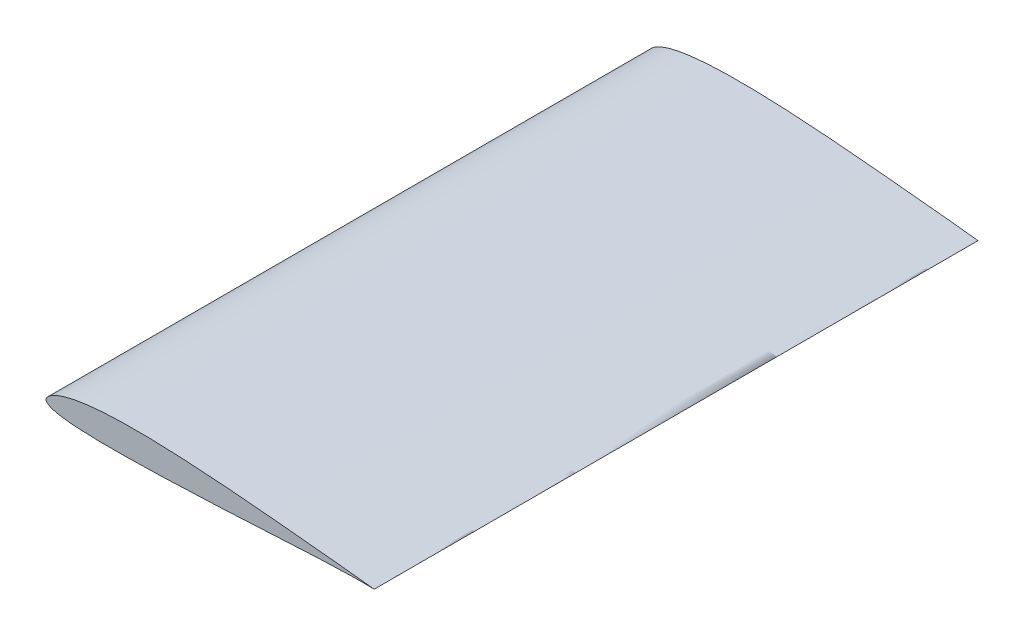
ISO-10303-21;
HEADER;
FILE_DESCRIPTION(('STEP AP214'),'2;1');
FILE_NAME('part.step','',(''),(''),'','','');
FILE_SCHEMA(('AUTOMOTIVE_DESIGN { 1 0 10303 214 1 1 1 1 }'));
ENDSEC;
DATA;
#1=APPLICATION_CONTEXT('core data for automotive mechanical design processes');
#2=APPLICATION_PROTOCOL_DEFINITION('international standard','automotive_design',2000,#1);
#3=PRODUCT_CONTEXT('',#1,'mechanical');
#4=PRODUCT('Part','Part','',(#3));
#5=PRODUCT_RELATED_PRODUCT_CATEGORY('part','',(#4));
#6=PRODUCT_DEFINITION_FORMATION('','',#4);
#7=PRODUCT_DEFINITION_CONTEXT('part definition',#1,'design');
#8=PRODUCT_DEFINITION('design','',#6,#7);
#9=PRODUCT_DEFINITION_SHAPE('','',#8);
#10=(LENGTH_UNIT() NAMED_UNIT(*) SI_UNIT(.MILLI.,.METRE.));
#11=(NAMED_UNIT(*) PLANE_ANGLE_UNIT() SI_UNIT($,.RADIAN.));
#12=(NAMED_UNIT(*) SI_UNIT($,.STERADIAN.) SOLID_ANGLE_UNIT());
#13=UNCERTAINTY_MEASURE_WITH_UNIT(LENGTH_MEASURE(1.E-05),#10,'distance_accuracy_value','');
#14=(GEOMETRIC_REPRESENTATION_CONTEXT(3) GLOBAL_UNCERTAINTY_ASSIGNED_CONTEXT((#13)) GLOBAL_UNIT_ASSIGNED_CONTEXT((#10,
#11,#12)) REPRESENTATION_CONTEXT('',''));
#15=CARTESIAN_POINT('',(0.,0.,0.));
#16=DIRECTION('',(0.,0.,1.));
#17=DIRECTION('',(1.,0.,0.));
#18=AXIS2_PLACEMENT_3D('',#15,#16,#17);
#19=CARTESIAN_POINT('',(125.,0.,230.));
#20=CARTESIAN_POINT('',(125.000051843613,0.00406372553250439,230.));
#21=CARTESIAN_POINT('',(124.156806782813,0.0755180317852404,230.));
#22=CARTESIAN_POINT('',(123.306301537015,0.182926610468012,230.));
#23=CARTESIAN_POINT('',(121.271537217048,0.419893677264012,230.));
#24=CARTESIAN_POINT('',(118.798426643432,0.712961509812303,230.));
#25=CARTESIAN_POINT('',(115.590288607837,1.05754578227251,230.));
#26=CARTESIAN_POINT('',(111.815042282613,1.44829560747886,230.));
#27=CARTESIAN_POINT('',(107.472282638317,1.89191265732372,230.));
#28=CARTESIAN_POINT('',(102.633370820047,2.37822068635726,230.));
#29=CARTESIAN_POINT('',(97.3569310280859,2.90426883520567,230.));
#30=CARTESIAN_POINT('',(91.7104855623496,3.45304997950713,230.));
#31=CARTESIAN_POINT('',(85.7656977338865,4.02103071092295,230.));
#32=CARTESIAN_POINT('',(79.5957960257255,4.58706398343916,230.));
#33=CARTESIAN_POINT('',(73.2733670987292,5.13521266551903,230.));
#34=CARTESIAN_POINT('',(66.8704254837791,5.64764322107569,230.));
#35=CARTESIAN_POINT('',(60.4567303279209,6.10516274386312,230.));
#36=CARTESIAN_POINT('',(54.1027810213215,6.49986280641166,230.));
#37=CARTESIAN_POINT('',(47.8750193390963,6.80798459402946,230.));
#38=CARTESIAN_POINT('',(41.8370577152785,7.02122305475196,230.));
#39=CARTESIAN_POINT('',(36.0473538336559,7.1228569033168,230.));
#40=CARTESIAN_POINT('',(30.5600607771911,7.10624180654014,230.));
#41=CARTESIAN_POINT('',(25.4249684578504,6.9631290083378,230.));
#42=CARTESIAN_POINT('',(20.686118619632,6.68956320518335,230.));
#43=CARTESIAN_POINT('',(16.3816535199495,6.28745804572233,230.));
#44=CARTESIAN_POINT('',(12.5426528777593,5.75584823866009,230.));
#45=CARTESIAN_POINT('',(9.19420704646218,5.10359041370916,230.));
#46=CARTESIAN_POINT('',(6.35183211356645,4.34356481199376,230.));
#47=CARTESIAN_POINT('',(4.02671334880562,3.48898877594673,230.));
#48=CARTESIAN_POINT('',(2.21859695570573,2.57848409900471,230.));
#49=CARTESIAN_POINT('',(0.931834887521361,1.63547743871586,230.));
#50=CARTESIAN_POINT('',(0.141510244197097,0.760580189222865,230.));
#51=CARTESIAN_POINT('',(-0.119731905527547,-0.258159160191916,230.));
#52=CARTESIAN_POINT('',(0.681576766941182,-1.04794161312081,230.));
#53=CARTESIAN_POINT('',(1.88148540527061,-1.66869804112858,230.));
#54=CARTESIAN_POINT('',(3.71646375810727,-2.24752401973034,230.));
#55=CARTESIAN_POINT('',(6.13408565764395,-2.69444653011502,230.));
#56=CARTESIAN_POINT('',(9.1577256700586,-3.04950028855815,230.));
#57=CARTESIAN_POINT('',(12.7623641485014,-3.31678170138498,230.));
#58=CARTESIAN_POINT('',(16.9181369141008,-3.49587141327314,230.));
#59=CARTESIAN_POINT('',(21.5840943374065,-3.59063538850989,230.));
#60=CARTESIAN_POINT('',(26.7151669899614,-3.60219436273376,230.));
#61=CARTESIAN_POINT('',(32.2600816150503,-3.54056205369908,230.));
#62=CARTESIAN_POINT('',(38.1598640116797,-3.4152676667714,230.));
#63=CARTESIAN_POINT('',(44.3491473549067,-3.23573983229352,230.));
#64=CARTESIAN_POINT('',(50.7584838278518,-3.01287548086214,230.));
#65=CARTESIAN_POINT('',(57.3153278150656,-2.7516588049732,230.));
#66=CARTESIAN_POINT('',(63.945886260163,-2.457839306861,230.));
#67=CARTESIAN_POINT('',(70.576106741489,-2.14007688701051,230.));
#68=CARTESIAN_POINT('',(77.1337703398548,-1.80205427761187,230.));
#69=CARTESIAN_POINT('',(83.5503063843536,-1.44978485148728,230.));
#70=CARTESIAN_POINT('',(89.7570546149246,-1.09974279631042,230.));
#71=CARTESIAN_POINT('',(95.6822134920602,-0.777183276606384,230.));
#72=CARTESIAN_POINT('',(101.24874525476,-0.497077189044087,230.));
#73=CARTESIAN_POINT('',(106.378648905834,-0.269828361651497,230.));
#74=CARTESIAN_POINT('',(111.004035499426,-0.0972430389112498,230.));
#75=CARTESIAN_POINT('',(115.040857140666,0.0163021568231871,230.));
#76=CARTESIAN_POINT('',(118.477205870117,0.0707709936907142,230.));
#77=CARTESIAN_POINT('',(121.113380674744,0.083044234806778,230.));
#78=CARTESIAN_POINT('',(123.258942212779,0.0483438141923197,230.));
#79=CARTESIAN_POINT('',(124.140686301501,0.0361458873158221,230.));
#80=CARTESIAN_POINT('',(124.999948045472,-0.00407241952502587,230.));
#81=CARTESIAN_POINT('',(125.,0.,230.));
#82=B_SPLINE_CURVE_WITH_KNOTS('',3,(#19,#20,#21,#22,#23,#24,#25,#26,#27,#28,#29,#30,#31,#32,#33,
#34,#35,#36,#37,#38,#39,#40,#41,#42,#43,#44,#45,#46,#47,#48,#49,#50,#51,#52,#53,#54,#55,#56,#57,
#58,#59,#60,#61,#62,#63,#64,#65,#66,#67,#68,#69,#70,#71,#72,#73,#74,#75,#76,#77,#78,#79,#80,
#81),.UNSPECIFIED.,.T.,.F.,(4,1,1,1,1,1,1,1,1,1,1,1,1,1,1,1,1,1,1,1,1,1,1,1,1,1,1,1,1,1,1,1,1,1,
1,1,1,1,1,1,1,1,1,1,1,1,1,1,1,1,1,1,1,1,1,1,1,1,1,1,4),(0.,0.00158294177596934,
0.00623261944527917,0.0137420470433559,0.0238950499665753,0.0365830594671071,0.0516728933971106,
0.0689888890805194,0.0882878284736586,0.10932648138131,0.131834637220327,0.155528852480395,
0.180107797957285,0.205270560711444,0.230746378053032,0.256240763149553,0.281481346238197,
0.306200469272032,0.33014364467907,0.35308814419074,0.374829533421586,0.395176840895591,
0.413968091946057,0.431080740058548,0.446404500799392,0.459885544831251,0.47148982920882,
0.481241102115657,0.489196019770918,0.495419125392638,0.50000902942107,0.503131826320025,
0.506605442070247,0.512016532653902,0.519461780052683,0.529149772894822,0.541186766280073,
0.555507260063927,0.571990101348795,0.59048064774987,0.610819263610938,0.632803736332878,
0.656204678445494,0.680761480606587,0.706192777477701,0.73221713759693,0.758538061655459,
0.784858630300763,0.810892117815396,0.836366001414543,0.861025393722553,0.884574425994155,
0.906699141250489,0.927082413762927,0.945448143196725,0.961520642761651,0.975064942785504,
0.985841724693986,0.993665619457044,0.998413671655756,1.),.UNSPECIFIED.);
#83=DIRECTION('',(0.,0.,-1.));
#84=VECTOR('',#83,1.);
#85=SURFACE_OF_LINEAR_EXTRUSION('',#82,#84);
#86=CARTESIAN_POINT('',(125.,0.,230.));
#87=VERTEX_POINT('',#86);
#88=EDGE_CURVE('E11',#87,#87,#82,.T.);
#89=ORIENTED_EDGE('',*,*,#88,.F.);
#90=EDGE_LOOP('',(#89));
#91=FACE_BOUND('',#90,.T.);
#92=CARTESIAN_POINT('',(125.,0.,0.));
#93=CARTESIAN_POINT('',(125.000051843613,0.00406372553250439,0.));
#94=CARTESIAN_POINT('',(124.156806782813,0.0755180317852404,0.));
#95=CARTESIAN_POINT('',(123.306301537015,0.182926610468012,0.));
#96=CARTESIAN_POINT('',(121.271537217048,0.419893677264012,0.));
#97=CARTESIAN_POINT('',(118.798426643432,0.712961509812303,0.));
#98=CARTESIAN_POINT('',(115.590288607837,1.05754578227251,0.));
#99=CARTESIAN_POINT('',(111.815042282613,1.44829560747886,0.));
#100=CARTESIAN_POINT('',(107.472282638317,1.89191265732372,0.));
#101=CARTESIAN_POINT('',(102.633370820047,2.37822068635726,0.));
#102=CARTESIAN_POINT('',(97.3569310280859,2.90426883520567,0.));
#103=CARTESIAN_POINT('',(91.7104855623496,3.45304997950713,0.));
#104=CARTESIAN_POINT('',(85.7656977338865,4.02103071092295,0.));
#105=CARTESIAN_POINT('',(79.5957960257255,4.58706398343916,0.));
#106=CARTESIAN_POINT('',(73.2733670987292,5.13521266551903,0.));
#107=CARTESIAN_POINT('',(66.8704254837791,5.64764322107569,0.));
#108=CARTESIAN_POINT('',(60.4567303279209,6.10516274386312,0.));
#109=CARTESIAN_POINT('',(54.1027810213215,6.49986280641166,0.));
#110=CARTESIAN_POINT('',(47.8750193390963,6.80798459402946,0.));
#111=CARTESIAN_POINT('',(41.8370577152785,7.02122305475196,0.));
#112=CARTESIAN_POINT('',(36.0473538336559,7.1228569033168,0.));
#113=CARTESIAN_POINT('',(30.5600607771911,7.10624180654014,0.));
#114=CARTESIAN_POINT('',(25.4249684578504,6.9631290083378,0.));
#115=CARTESIAN_POINT('',(20.686118619632,6.68956320518335,0.));
#116=CARTESIAN_POINT('',(16.3816535199495,6.28745804572233,0.));
#117=CARTESIAN_POINT('',(12.5426528777593,5.75584823866009,0.));
#118=CARTESIAN_POINT('',(9.19420704646218,5.10359041370916,0.));
#119=CARTESIAN_POINT('',(6.35183211356645,4.34356481199376,0.));
#120=CARTESIAN_POINT('',(4.02671334880562,3.48898877594673,0.));
#121=CARTESIAN_POINT('',(2.21859695570573,2.57848409900471,0.));
#122=CARTESIAN_POINT('',(0.931834887521361,1.63547743871586,0.));
#123=CARTESIAN_POINT('',(0.141510244197097,0.760580189222865,0.));
#124=CARTESIAN_POINT('',(-0.119731905527547,-0.258159160191916,0.));
#125=CARTESIAN_POINT('',(0.681576766941182,-1.04794161312081,0.));
#126=CARTESIAN_POINT('',(1.88148540527061,-1.66869804112858,0.));
#127=CARTESIAN_POINT('',(3.71646375810727,-2.24752401973034,0.));
#128=CARTESIAN_POINT('',(6.13408565764395,-2.69444653011502,0.));
#129=CARTESIAN_POINT('',(9.1577256700586,-3.04950028855815,0.));
#130=CARTESIAN_POINT('',(12.7623641485014,-3.31678170138498,0.));
#131=CARTESIAN_POINT('',(16.9181369141008,-3.49587141327314,0.));
#132=CARTESIAN_POINT('',(21.5840943374065,-3.59063538850989,0.));
#133=CARTESIAN_POINT('',(26.7151669899614,-3.60219436273376,0.));
#134=CARTESIAN_POINT('',(32.2600816150503,-3.54056205369908,0.));
#135=CARTESIAN_POINT('',(38.1598640116797,-3.4152676667714,0.));
#136=CARTESIAN_POINT('',(44.3491473549067,-3.23573983229352,0.));
#137=CARTESIAN_POINT('',(50.7584838278518,-3.01287548086214,0.));
#138=CARTESIAN_POINT('',(57.3153278150656,-2.7516588049732,0.));
#139=CARTESIAN_POINT('',(63.945886260163,-2.457839306861,0.));
#140=CARTESIAN_POINT('',(70.576106741489,-2.14007688701051,0.));
#141=CARTESIAN_POINT('',(77.1337703398548,-1.80205427761187,0.));
#142=CARTESIAN_POINT('',(83.5503063843536,-1.44978485148728,0.));
#143=CARTESIAN_POINT('',(89.7570546149246,-1.09974279631042,0.));
#144=CARTESIAN_POINT('',(95.6822134920602,-0.777183276606384,0.));
#145=CARTESIAN_POINT('',(101.24874525476,-0.497077189044087,0.));
#146=CARTESIAN_POINT('',(106.378648905834,-0.269828361651497,0.));
#147=CARTESIAN_POINT('',(111.004035499426,-0.0972430389112498,0.));
#148=CARTESIAN_POINT('',(115.040857140666,0.0163021568231871,0.));
#149=CARTESIAN_POINT('',(118.477205870117,0.0707709936907142,0.));
#150=CARTESIAN_POINT('',(121.113380674744,0.083044234806778,0.));
#151=CARTESIAN_POINT('',(123.258942212779,0.0483438141923197,0.));
#152=CARTESIAN_POINT('',(124.140686301501,0.0361458873158221,0.));
#153=CARTESIAN_POINT('',(124.999948045472,-0.00407241952502587,0.));
#154=CARTESIAN_POINT('',(125.,0.,0.));
#155=B_SPLINE_CURVE_WITH_KNOTS('',3,(#92,#93,#94,#95,#96,#97,#98,#99,#100,#101,#102,#103,#104,
#105,#106,#107,#108,#109,#110,#111,#112,#113,#114,#115,#116,#117,#118,#119,#120,#121,#122,#123,
#124,#125,#126,#127,#128,#129,#130,#131,#132,#133,#134,#135,#136,#137,#138,#139,#140,#141,#142,
#143,#144,#145,#146,#147,#148,#149,#150,#151,#152,#153,#154),.UNSPECIFIED.,.T.,.F.,(4,1,1,1,1,1,
1,1,1,1,1,1,1,1,1,1,1,1,1,1,1,1,1,1,1,1,1,1,1,1,1,1,1,1,1,1,1,1,1,1,1,1,1,1,1,1,1,1,1,1,1,1,1,1,
1,1,1,1,1,1,4),(0.,0.00158294177596934,0.00623261944527917,0.0137420470433559,
0.0238950499665753,0.0365830594671071,0.0516728933971106,0.0689888890805194,0.0882878284736586,
0.10932648138131,0.131834637220327,0.155528852480395,0.180107797957285,0.205270560711444,
0.230746378053032,0.256240763149553,0.281481346238197,0.306200469272032,0.33014364467907,
0.35308814419074,0.374829533421586,0.395176840895591,0.413968091946057,0.431080740058548,
0.446404500799392,0.459885544831251,0.47148982920882,0.481241102115657,0.489196019770918,
0.495419125392638,0.50000902942107,0.503131826320025,0.506605442070247,0.512016532653902,
0.519461780052683,0.529149772894822,0.541186766280073,0.555507260063927,0.571990101348795,
0.59048064774987,0.610819263610938,0.632803736332878,0.656204678445494,0.680761480606587,
0.706192777477701,0.73221713759693,0.758538061655459,0.784858630300763,0.810892117815396,
0.836366001414543,0.861025393722553,0.884574425994155,0.906699141250489,0.927082413762927,
0.945448143196725,0.961520642761651,0.975064942785504,0.985841724693986,0.993665619457044,
0.998413671655756,1.),.UNSPECIFIED.);
#156=CARTESIAN_POINT('',(125.,0.,0.));
#157=VERTEX_POINT('',#156);
#158=EDGE_CURVE('E47',#157,#157,#155,.T.);
#159=ORIENTED_EDGE('',*,*,#158,.T.);
#160=EDGE_LOOP('',(#159));
#161=FACE_BOUND('',#160,.T.);
#162=ADVANCED_FACE('F43',(#91,#161),#85,.F.);
#163=CARTESIAN_POINT('',(0.15042497141773,0.593357216096752,230.));
#164=DIRECTION('',(0.,0.,-1.));
#165=DIRECTION('',(-1.,0.,0.));
#166=AXIS2_PLACEMENT_3D('',#163,#164,#165);
#167=PLANE('',#166);
#168=ORIENTED_EDGE('',*,*,#88,.T.);
#169=EDGE_LOOP('',(#168));
#170=FACE_BOUND('',#169,.T.);
#171=ADVANCED_FACE('F156',(#170),#167,.F.);
#172=CARTESIAN_POINT('',(0.15042497141773,0.593357216096752,0.));
#173=DIRECTION('',(0.,0.,-1.));
#174=DIRECTION('',(-1.,0.,0.));
#175=AXIS2_PLACEMENT_3D('',#172,#173,#174);
#176=PLANE('',#175);
#177=DIRECTION('',(0.,-1.,0.));
#178=VECTOR('',#177,1.);
#179=CARTESIAN_POINT('',(55.9467051912446,2.62643102366267,0.));
#180=LINE('',#179,#178);
#181=CARTESIAN_POINT('',(55.9467051912446,2.62643102366267,0.));
#182=VERTEX_POINT('',#181);
#183=CARTESIAN_POINT('',(55.9467051912446,0.426431023662673,0.));
#184=VERTEX_POINT('',#183);
#185=EDGE_CURVE('E60',#182,#184,#180,.T.);
#186=ORIENTED_EDGE('',*,*,#185,.F.);
#187=DIRECTION('',(1.,0.,0.));
#188=VECTOR('',#187,1.);
#189=CARTESIAN_POINT('',(55.9467051912446,2.62643102366267,0.));
#190=LINE('',#189,#188);
#191=CARTESIAN_POINT('',(40.7467051912446,2.62643102366268,0.));
#192=VERTEX_POINT('',#191);
#193=EDGE_CURVE('E115',#192,#182,#190,.T.);
#194=ORIENTED_EDGE('',*,*,#193,.F.);
#195=DIRECTION('',(0.,1.,0.));
#196=VECTOR('',#195,1.);
#197=CARTESIAN_POINT('',(40.7467051912446,2.62643102366268,0.));
#198=LINE('',#197,#196);
#199=CARTESIAN_POINT('',(40.7467051912446,0.426431023662675,0.));
#200=VERTEX_POINT('',#199);
#201=EDGE_CURVE('E124',#200,#192,#198,.T.);
#202=ORIENTED_EDGE('',*,*,#201,.F.);
#203=DIRECTION('',(-1.,0.,0.));
#204=VECTOR('',#203,1.);
#205=CARTESIAN_POINT('',(55.9467051912446,0.426431023662673,0.));
#206=LINE('',#205,#204);
#207=EDGE_CURVE('E95',#184,#200,#206,.T.);
#208=ORIENTED_EDGE('',*,*,#207,.F.);
#209=EDGE_LOOP('',(#186,#194,#202,#208));
#210=FACE_BOUND('',#209,.T.);
#211=ORIENTED_EDGE('',*,*,#158,.F.);
#212=EDGE_LOOP('',(#211));
#213=FACE_BOUND('',#212,.T.);
#214=ADVANCED_FACE('F141',(#210,#213),#176,.T.);
#215=CARTESIAN_POINT('',(55.9467051912446,2.62643102366267,220.));
#216=DIRECTION('',(1.,0.,0.));
#217=DIRECTION('',(0.,0.,-1.));
#218=AXIS2_PLACEMENT_3D('',#215,#216,#217);
#219=PLANE('',#218);
#220=ORIENTED_EDGE('',*,*,#185,.T.);
#221=DIRECTION('',(0.,0.,-1.));
#222=VECTOR('',#221,1.);
#223=CARTESIAN_POINT('',(55.9467051912446,0.426431023662673,220.));
#224=LINE('',#223,#222);
#225=CARTESIAN_POINT('',(55.9467051912446,0.426431023662673,220.));
#226=VERTEX_POINT('',#225);
#227=EDGE_CURVE('E83',#226,#184,#224,.T.);
#228=ORIENTED_EDGE('',*,*,#227,.F.);
#229=DIRECTION('',(0.,-1.,0.));
#230=VECTOR('',#229,1.);
#231=CARTESIAN_POINT('',(55.9467051912446,2.62643102366267,220.));
#232=LINE('',#231,#230);
#233=CARTESIAN_POINT('',(55.9467051912446,2.62643102366267,220.));
#234=VERTEX_POINT('',#233);
#235=EDGE_CURVE('E111',#234,#226,#232,.T.);
#236=ORIENTED_EDGE('',*,*,#235,.F.);
#237=DIRECTION('',(0.,0.,-1.));
#238=VECTOR('',#237,1.);
#239=CARTESIAN_POINT('',(55.9467051912446,2.62643102366267,220.));
#240=LINE('',#239,#238);
#241=EDGE_CURVE('E68',#234,#182,#240,.T.);
#242=ORIENTED_EDGE('',*,*,#241,.T.);
#243=EDGE_LOOP('',(#220,#228,#236,#242));
#244=FACE_BOUND('',#243,.T.);
#245=ADVANCED_FACE('F146',(#244),#219,.F.);
#246=CARTESIAN_POINT('',(55.9467051912446,2.62643102366267,220.));
#247=DIRECTION('',(0.,1.,0.));
#248=DIRECTION('',(-1.,0.,0.));
#249=AXIS2_PLACEMENT_3D('',#246,#247,#248);
#250=PLANE('',#249);
#251=ORIENTED_EDGE('',*,*,#193,.T.);
#252=ORIENTED_EDGE('',*,*,#241,.F.);
#253=DIRECTION('',(1.,0.,0.));
#254=VECTOR('',#253,1.);
#255=CARTESIAN_POINT('',(55.9467051912446,2.62643102366267,220.));
#256=LINE('',#255,#254);
#257=CARTESIAN_POINT('',(40.7467051912446,2.62643102366268,220.));
#258=VERTEX_POINT('',#257);
#259=EDGE_CURVE('E108',#258,#234,#256,.T.);
#260=ORIENTED_EDGE('',*,*,#259,.F.);
#261=DIRECTION('',(0.,0.,-1.));
#262=VECTOR('',#261,1.);
#263=CARTESIAN_POINT('',(40.7467051912446,2.62643102366268,220.));
#264=LINE('',#263,#262);
#265=EDGE_CURVE('E100',#258,#192,#264,.T.);
#266=ORIENTED_EDGE('',*,*,#265,.T.);
#267=EDGE_LOOP('',(#251,#252,#260,#266));
#268=FACE_BOUND('',#267,.T.);
#269=ADVANCED_FACE('F144',(#268),#250,.F.);
#270=CARTESIAN_POINT('',(40.7467051912446,2.62643102366268,220.));
#271=DIRECTION('',(-1.,0.,0.));
#272=DIRECTION('',(0.,0.,1.));
#273=AXIS2_PLACEMENT_3D('',#270,#271,#272);
#274=PLANE('',#273);
#275=ORIENTED_EDGE('',*,*,#201,.T.);
#276=ORIENTED_EDGE('',*,*,#265,.F.);
#277=DIRECTION('',(0.,1.,0.));
#278=VECTOR('',#277,1.);
#279=CARTESIAN_POINT('',(40.7467051912446,2.62643102366268,220.));
#280=LINE('',#279,#278);
#281=CARTESIAN_POINT('',(40.7467051912446,0.426431023662675,220.));
#282=VERTEX_POINT('',#281);
#283=EDGE_CURVE('E103',#282,#258,#280,.T.);
#284=ORIENTED_EDGE('',*,*,#283,.F.);
#285=DIRECTION('',(0.,0.,-1.));
#286=VECTOR('',#285,1.);
#287=CARTESIAN_POINT('',(40.7467051912446,0.426431023662675,220.));
#288=LINE('',#287,#286);
#289=EDGE_CURVE('E88',#282,#200,#288,.T.);
#290=ORIENTED_EDGE('',*,*,#289,.T.);
#291=EDGE_LOOP('',(#275,#276,#284,#290));
#292=FACE_BOUND('',#291,.T.);
#293=ADVANCED_FACE('F104',(#292),#274,.F.);
#294=CARTESIAN_POINT('',(55.9467051912446,0.426431023662673,220.));
#295=DIRECTION('',(0.,-1.,0.));
#296=DIRECTION('',(1.,0.,0.));
#297=AXIS2_PLACEMENT_3D('',#294,#295,#296);
#298=PLANE('',#297);
#299=ORIENTED_EDGE('',*,*,#207,.T.);
#300=ORIENTED_EDGE('',*,*,#289,.F.);
#301=DIRECTION('',(-1.,0.,0.));
#302=VECTOR('',#301,1.);
#303=CARTESIAN_POINT('',(55.9467051912446,0.426431023662673,220.));
#304=LINE('',#303,#302);
#305=EDGE_CURVE('E92',#226,#282,#304,.T.);
#306=ORIENTED_EDGE('',*,*,#305,.F.);
#307=ORIENTED_EDGE('',*,*,#227,.T.);
#308=EDGE_LOOP('',(#299,#300,#306,#307));
#309=FACE_BOUND('',#308,.T.);
#310=ADVANCED_FACE('F90',(#309),#298,.F.);
#311=CARTESIAN_POINT('',(0.,0.,220.));
#312=DIRECTION('',(0.,0.,-1.));
#313=DIRECTION('',(-1.,0.,0.));
#314=AXIS2_PLACEMENT_3D('',#311,#312,#313);
#315=PLANE('',#314);
#316=ORIENTED_EDGE('',*,*,#235,.T.);
#317=ORIENTED_EDGE('',*,*,#305,.T.);
#318=ORIENTED_EDGE('',*,*,#283,.T.);
#319=ORIENTED_EDGE('',*,*,#259,.T.);
#320=EDGE_LOOP('',(#316,#317,#318,#319));
#321=FACE_BOUND('',#320,.T.);
#322=ADVANCED_FACE('F110',(#321),#315,.T.);
#323=CLOSED_SHELL('',(#162,#171,#214,#245,#269,#293,#310,#322));
#324=MANIFOLD_SOLID_BREP('B2',#323);
#325=ADVANCED_BREP_SHAPE_REPRESENTATION('',(#18,#324),#14);
#326=SHAPE_DEFINITION_REPRESENTATION(#9,#325);
ENDSEC;
END-ISO-10303-21;
